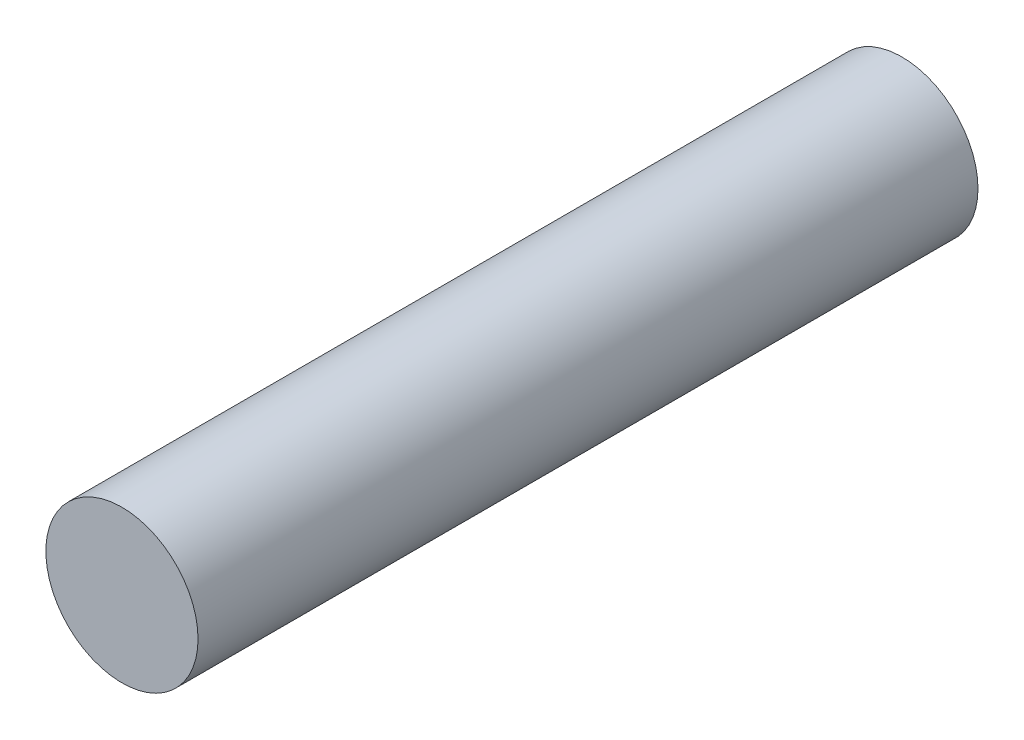
ISO-10303-21;
HEADER;
FILE_DESCRIPTION(('STEP AP214'),'2;1');
FILE_NAME('part.step','',(''),(''),'','','');
FILE_SCHEMA(('AUTOMOTIVE_DESIGN { 1 0 10303 214 1 1 1 1 }'));
ENDSEC;
DATA;
#1=APPLICATION_CONTEXT('core data for automotive mechanical design processes');
#2=APPLICATION_PROTOCOL_DEFINITION('international standard','automotive_design',2000,#1);
#3=PRODUCT_CONTEXT('',#1,'mechanical');
#4=PRODUCT('Part','Part','',(#3));
#5=PRODUCT_RELATED_PRODUCT_CATEGORY('part','',(#4));
#6=PRODUCT_DEFINITION_FORMATION('','',#4);
#7=PRODUCT_DEFINITION_CONTEXT('part definition',#1,'design');
#8=PRODUCT_DEFINITION('design','',#6,#7);
#9=PRODUCT_DEFINITION_SHAPE('','',#8);
#10=(LENGTH_UNIT() NAMED_UNIT(*) SI_UNIT(.MILLI.,.METRE.));
#11=(NAMED_UNIT(*) PLANE_ANGLE_UNIT() SI_UNIT($,.RADIAN.));
#12=(NAMED_UNIT(*) SI_UNIT($,.STERADIAN.) SOLID_ANGLE_UNIT());
#13=UNCERTAINTY_MEASURE_WITH_UNIT(LENGTH_MEASURE(1.E-05),#10,'distance_accuracy_value','');
#14=(GEOMETRIC_REPRESENTATION_CONTEXT(3) GLOBAL_UNCERTAINTY_ASSIGNED_CONTEXT((#13)) GLOBAL_UNIT_ASSIGNED_CONTEXT((#10,
#11,#12)) REPRESENTATION_CONTEXT('',''));
#15=CARTESIAN_POINT('',(0.,0.,0.));
#16=DIRECTION('',(0.,0.,1.));
#17=DIRECTION('',(1.,0.,0.));
#18=AXIS2_PLACEMENT_3D('',#15,#16,#17);
#19=CARTESIAN_POINT('',(0.,0.,41.));
#20=DIRECTION('',(0.,0.,-1.));
#21=DIRECTION('',(-1.,0.,0.));
#22=AXIS2_PLACEMENT_3D('',#19,#20,#21);
#23=CYLINDRICAL_SURFACE('',#22,4.);
#24=CARTESIAN_POINT('',(0.,0.,41.));
#25=DIRECTION('',(0.,0.,1.));
#26=DIRECTION('',(1.,0.,0.));
#27=AXIS2_PLACEMENT_3D('',#24,#25,#26);
#28=CIRCLE('',#27,4.);
#29=CARTESIAN_POINT('',(4.,0.,41.));
#30=VERTEX_POINT('',#29);
#31=EDGE_CURVE('E12',#30,#30,#28,.T.);
#32=ORIENTED_EDGE('',*,*,#31,.F.);
#33=EDGE_LOOP('',(#32));
#34=FACE_BOUND('',#33,.T.);
#35=CARTESIAN_POINT('',(0.,0.,0.));
#36=DIRECTION('',(0.,0.,1.));
#37=DIRECTION('',(1.,0.,0.));
#38=AXIS2_PLACEMENT_3D('',#35,#36,#37);
#39=CIRCLE('',#38,4.);
#40=CARTESIAN_POINT('',(4.,0.,0.));
#41=VERTEX_POINT('',#40);
#42=EDGE_CURVE('E44',#41,#41,#39,.T.);
#43=ORIENTED_EDGE('',*,*,#42,.T.);
#44=EDGE_LOOP('',(#43));
#45=FACE_BOUND('',#44,.T.);
#46=ADVANCED_FACE('F41',(#34,#45),#23,.T.);
#47=CARTESIAN_POINT('',(0.,0.,41.));
#48=DIRECTION('',(0.,0.,1.));
#49=DIRECTION('',(1.,0.,0.));
#50=AXIS2_PLACEMENT_3D('',#47,#48,#49);
#51=PLANE('',#50);
#52=ORIENTED_EDGE('',*,*,#31,.T.);
#53=EDGE_LOOP('',(#52));
#54=FACE_BOUND('',#53,.T.);
#55=ADVANCED_FACE('F56',(#54),#51,.T.);
#56=CARTESIAN_POINT('',(0.,0.,0.));
#57=DIRECTION('',(0.,0.,1.));
#58=DIRECTION('',(1.,0.,0.));
#59=AXIS2_PLACEMENT_3D('',#56,#57,#58);
#60=PLANE('',#59);
#61=ORIENTED_EDGE('',*,*,#42,.F.);
#62=EDGE_LOOP('',(#61));
#63=FACE_BOUND('',#62,.T.);
#64=ADVANCED_FACE('F54',(#63),#60,.F.);
#65=CLOSED_SHELL('',(#46,#55,#64));
#66=MANIFOLD_SOLID_BREP('B2',#65);
#67=ADVANCED_BREP_SHAPE_REPRESENTATION('',(#18,#66),#14);
#68=SHAPE_DEFINITION_REPRESENTATION(#9,#67);
ENDSEC;
END-ISO-10303-21;
